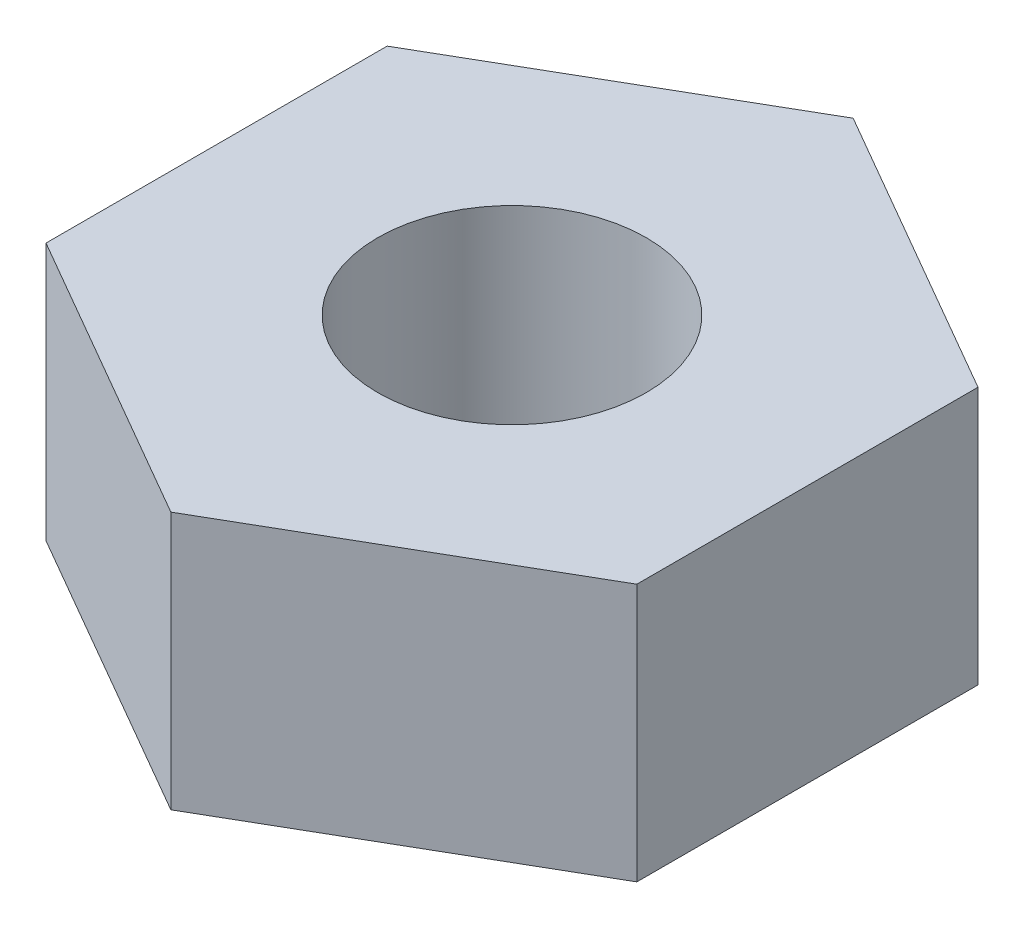
ISO-10303-21;
HEADER;
FILE_DESCRIPTION(('STEP AP214'),'2;1');
FILE_NAME('part.step','',(''),(''),'','','');
FILE_SCHEMA(('AUTOMOTIVE_DESIGN { 1 0 10303 214 1 1 1 1 }'));
ENDSEC;
DATA;
#1=APPLICATION_CONTEXT('core data for automotive mechanical design processes');
#2=APPLICATION_PROTOCOL_DEFINITION('international standard','automotive_design',2000,#1);
#3=PRODUCT_CONTEXT('',#1,'mechanical');
#4=PRODUCT('Part','Part','',(#3));
#5=PRODUCT_RELATED_PRODUCT_CATEGORY('part','',(#4));
#6=PRODUCT_DEFINITION_FORMATION('','',#4);
#7=PRODUCT_DEFINITION_CONTEXT('part definition',#1,'design');
#8=PRODUCT_DEFINITION('design','',#6,#7);
#9=PRODUCT_DEFINITION_SHAPE('','',#8);
#10=(LENGTH_UNIT() NAMED_UNIT(*) SI_UNIT(.MILLI.,.METRE.));
#11=(NAMED_UNIT(*) PLANE_ANGLE_UNIT() SI_UNIT($,.RADIAN.));
#12=(NAMED_UNIT(*) SI_UNIT($,.STERADIAN.) SOLID_ANGLE_UNIT());
#13=UNCERTAINTY_MEASURE_WITH_UNIT(LENGTH_MEASURE(1.E-05),#10,'distance_accuracy_value','');
#14=(GEOMETRIC_REPRESENTATION_CONTEXT(3) GLOBAL_UNCERTAINTY_ASSIGNED_CONTEXT((#13)) GLOBAL_UNIT_ASSIGNED_CONTEXT((#10,
#11,#12)) REPRESENTATION_CONTEXT('',''));
#15=CARTESIAN_POINT('',(0.,0.,0.));
#16=DIRECTION('',(0.,0.,1.));
#17=DIRECTION('',(1.,0.,0.));
#18=AXIS2_PLACEMENT_3D('',#15,#16,#17);
#19=CARTESIAN_POINT('',(0.,2.4,3.17542648054294));
#20=DIRECTION('',(-0.5,0.,-0.866025403784439));
#21=DIRECTION('',(-0.866025403784439,0.,0.5));
#22=AXIS2_PLACEMENT_3D('',#19,#20,#21);
#23=PLANE('',#22);
#24=DIRECTION('',(0.866025403784439,0.,-0.5));
#25=VECTOR('',#24,1.);
#26=CARTESIAN_POINT('',(0.,0.,3.17542648054294));
#27=LINE('',#26,#25);
#28=CARTESIAN_POINT('',(0.,0.,3.17542648054294));
#29=VERTEX_POINT('',#28);
#30=CARTESIAN_POINT('',(2.75,0.,1.58771324027147));
#31=VERTEX_POINT('',#30);
#32=EDGE_CURVE('E120',#29,#31,#27,.T.);
#33=ORIENTED_EDGE('',*,*,#32,.T.);
#34=DIRECTION('',(0.,-1.,0.));
#35=VECTOR('',#34,1.);
#36=CARTESIAN_POINT('',(2.75,2.4,1.58771324027147));
#37=LINE('',#36,#35);
#38=CARTESIAN_POINT('',(2.75,2.4,1.58771324027147));
#39=VERTEX_POINT('',#38);
#40=EDGE_CURVE('E11',#39,#31,#37,.T.);
#41=ORIENTED_EDGE('',*,*,#40,.F.);
#42=DIRECTION('',(0.866025403784439,0.,-0.5));
#43=VECTOR('',#42,1.);
#44=CARTESIAN_POINT('',(0.,2.4,3.17542648054294));
#45=LINE('',#44,#43);
#46=CARTESIAN_POINT('',(0.,2.4,3.17542648054294));
#47=VERTEX_POINT('',#46);
#48=EDGE_CURVE('E131',#47,#39,#45,.T.);
#49=ORIENTED_EDGE('',*,*,#48,.F.);
#50=DIRECTION('',(0.,-1.,0.));
#51=VECTOR('',#50,1.);
#52=CARTESIAN_POINT('',(0.,2.4,3.17542648054294));
#53=LINE('',#52,#51);
#54=EDGE_CURVE('E116',#47,#29,#53,.T.);
#55=ORIENTED_EDGE('',*,*,#54,.T.);
#56=EDGE_LOOP('',(#33,#41,#49,#55));
#57=FACE_BOUND('',#56,.T.);
#58=ADVANCED_FACE('F36',(#57),#23,.F.);
#59=CARTESIAN_POINT('',(2.75,2.4,1.58771324027147));
#60=DIRECTION('',(-1.,0.,0.));
#61=DIRECTION('',(0.,0.,1.));
#62=AXIS2_PLACEMENT_3D('',#59,#60,#61);
#63=PLANE('',#62);
#64=DIRECTION('',(0.,0.,-1.));
#65=VECTOR('',#64,1.);
#66=CARTESIAN_POINT('',(2.75,0.,1.58771324027147));
#67=LINE('',#66,#65);
#68=CARTESIAN_POINT('',(2.75,0.,-1.58771324027147));
#69=VERTEX_POINT('',#68);
#70=EDGE_CURVE('E123',#31,#69,#67,.T.);
#71=ORIENTED_EDGE('',*,*,#70,.T.);
#72=DIRECTION('',(0.,-1.,0.));
#73=VECTOR('',#72,1.);
#74=CARTESIAN_POINT('',(2.75,2.4,-1.58771324027147));
#75=LINE('',#74,#73);
#76=CARTESIAN_POINT('',(2.75,2.4,-1.58771324027147));
#77=VERTEX_POINT('',#76);
#78=EDGE_CURVE('E44',#77,#69,#75,.T.);
#79=ORIENTED_EDGE('',*,*,#78,.F.);
#80=DIRECTION('',(0.,0.,-1.));
#81=VECTOR('',#80,1.);
#82=CARTESIAN_POINT('',(2.75,2.4,1.58771324027147));
#83=LINE('',#82,#81);
#84=EDGE_CURVE('E89',#39,#77,#83,.T.);
#85=ORIENTED_EDGE('',*,*,#84,.F.);
#86=ORIENTED_EDGE('',*,*,#40,.T.);
#87=EDGE_LOOP('',(#71,#79,#85,#86));
#88=FACE_BOUND('',#87,.T.);
#89=ADVANCED_FACE('F156',(#88),#63,.F.);
#90=CARTESIAN_POINT('',(2.75,2.4,-1.58771324027147));
#91=DIRECTION('',(-0.5,0.,0.866025403784439));
#92=DIRECTION('',(0.866025403784439,0.,0.5));
#93=AXIS2_PLACEMENT_3D('',#90,#91,#92);
#94=PLANE('',#93);
#95=DIRECTION('',(-0.866025403784439,0.,-0.5));
#96=VECTOR('',#95,1.);
#97=CARTESIAN_POINT('',(2.75,0.,-1.58771324027147));
#98=LINE('',#97,#96);
#99=CARTESIAN_POINT('',(0.,0.,-3.17542648054294));
#100=VERTEX_POINT('',#99);
#101=EDGE_CURVE('E126',#69,#100,#98,.T.);
#102=ORIENTED_EDGE('',*,*,#101,.T.);
#103=DIRECTION('',(0.,-1.,0.));
#104=VECTOR('',#103,1.);
#105=CARTESIAN_POINT('',(0.,2.4,-3.17542648054294));
#106=LINE('',#105,#104);
#107=CARTESIAN_POINT('',(0.,2.4,-3.17542648054294));
#108=VERTEX_POINT('',#107);
#109=EDGE_CURVE('E111',#108,#100,#106,.T.);
#110=ORIENTED_EDGE('',*,*,#109,.F.);
#111=DIRECTION('',(-0.866025403784439,0.,-0.5));
#112=VECTOR('',#111,1.);
#113=CARTESIAN_POINT('',(2.75,2.4,-1.58771324027147));
#114=LINE('',#113,#112);
#115=EDGE_CURVE('E102',#77,#108,#114,.T.);
#116=ORIENTED_EDGE('',*,*,#115,.F.);
#117=ORIENTED_EDGE('',*,*,#78,.T.);
#118=EDGE_LOOP('',(#102,#110,#116,#117));
#119=FACE_BOUND('',#118,.T.);
#120=ADVANCED_FACE('F137',(#119),#94,.F.);
#121=CARTESIAN_POINT('',(0.,2.4,-3.17542648054294));
#122=DIRECTION('',(0.5,0.,0.866025403784439));
#123=DIRECTION('',(0.866025403784439,0.,-0.5));
#124=AXIS2_PLACEMENT_3D('',#121,#122,#123);
#125=PLANE('',#124);
#126=DIRECTION('',(-0.866025403784439,0.,0.5));
#127=VECTOR('',#126,1.);
#128=CARTESIAN_POINT('',(0.,0.,-3.17542648054294));
#129=LINE('',#128,#127);
#130=CARTESIAN_POINT('',(-2.75,0.,-1.58771324027147));
#131=VERTEX_POINT('',#130);
#132=EDGE_CURVE('E110',#100,#131,#129,.T.);
#133=ORIENTED_EDGE('',*,*,#132,.T.);
#134=DIRECTION('',(0.,-1.,0.));
#135=VECTOR('',#134,1.);
#136=CARTESIAN_POINT('',(-2.75,2.4,-1.58771324027147));
#137=LINE('',#136,#135);
#138=CARTESIAN_POINT('',(-2.75,2.4,-1.58771324027147));
#139=VERTEX_POINT('',#138);
#140=EDGE_CURVE('E107',#139,#131,#137,.T.);
#141=ORIENTED_EDGE('',*,*,#140,.F.);
#142=DIRECTION('',(-0.866025403784439,0.,0.5));
#143=VECTOR('',#142,1.);
#144=CARTESIAN_POINT('',(0.,2.4,-3.17542648054294));
#145=LINE('',#144,#143);
#146=EDGE_CURVE('E96',#108,#139,#145,.T.);
#147=ORIENTED_EDGE('',*,*,#146,.F.);
#148=ORIENTED_EDGE('',*,*,#109,.T.);
#149=EDGE_LOOP('',(#133,#141,#147,#148));
#150=FACE_BOUND('',#149,.T.);
#151=ADVANCED_FACE('F108',(#150),#125,.F.);
#152=CARTESIAN_POINT('',(-2.75,2.4,-1.58771324027147));
#153=DIRECTION('',(1.,0.,0.));
#154=DIRECTION('',(0.,0.,-1.));
#155=AXIS2_PLACEMENT_3D('',#152,#153,#154);
#156=PLANE('',#155);
#157=DIRECTION('',(0.,0.,1.));
#158=VECTOR('',#157,1.);
#159=CARTESIAN_POINT('',(-2.75,0.,-1.58771324027147));
#160=LINE('',#159,#158);
#161=CARTESIAN_POINT('',(-2.75,0.,1.58771324027147));
#162=VERTEX_POINT('',#161);
#163=EDGE_CURVE('E75',#131,#162,#160,.T.);
#164=ORIENTED_EDGE('',*,*,#163,.T.);
#165=DIRECTION('',(0.,-1.,0.));
#166=VECTOR('',#165,1.);
#167=CARTESIAN_POINT('',(-2.75,2.4,1.58771324027147));
#168=LINE('',#167,#166);
#169=CARTESIAN_POINT('',(-2.75,2.4,1.58771324027147));
#170=VERTEX_POINT('',#169);
#171=EDGE_CURVE('E112',#170,#162,#168,.T.);
#172=ORIENTED_EDGE('',*,*,#171,.F.);
#173=DIRECTION('',(0.,0.,1.));
#174=VECTOR('',#173,1.);
#175=CARTESIAN_POINT('',(-2.75,2.4,-1.58771324027147));
#176=LINE('',#175,#174);
#177=EDGE_CURVE('E100',#139,#170,#176,.T.);
#178=ORIENTED_EDGE('',*,*,#177,.F.);
#179=ORIENTED_EDGE('',*,*,#140,.T.);
#180=EDGE_LOOP('',(#164,#172,#178,#179));
#181=FACE_BOUND('',#180,.T.);
#182=ADVANCED_FACE('F114',(#181),#156,.F.);
#183=CARTESIAN_POINT('',(-2.75,2.4,1.58771324027147));
#184=DIRECTION('',(0.5,0.,-0.866025403784439));
#185=DIRECTION('',(-0.866025403784439,0.,-0.5));
#186=AXIS2_PLACEMENT_3D('',#183,#184,#185);
#187=PLANE('',#186);
#188=DIRECTION('',(0.866025403784439,0.,0.5));
#189=VECTOR('',#188,1.);
#190=CARTESIAN_POINT('',(-2.75,0.,1.58771324027147));
#191=LINE('',#190,#189);
#192=EDGE_CURVE('E81',#162,#29,#191,.T.);
#193=ORIENTED_EDGE('',*,*,#192,.T.);
#194=ORIENTED_EDGE('',*,*,#54,.F.);
#195=DIRECTION('',(0.866025403784439,0.,0.5));
#196=VECTOR('',#195,1.);
#197=CARTESIAN_POINT('',(-2.75,2.4,1.58771324027147));
#198=LINE('',#197,#196);
#199=EDGE_CURVE('E52',#170,#47,#198,.T.);
#200=ORIENTED_EDGE('',*,*,#199,.F.);
#201=ORIENTED_EDGE('',*,*,#171,.T.);
#202=EDGE_LOOP('',(#193,#194,#200,#201));
#203=FACE_BOUND('',#202,.T.);
#204=ADVANCED_FACE('F144',(#203),#187,.F.);
#205=CARTESIAN_POINT('',(0.,2.4,0.));
#206=DIRECTION('',(0.,1.,0.));
#207=DIRECTION('',(0.,0.,1.));
#208=AXIS2_PLACEMENT_3D('',#205,#206,#207);
#209=PLANE('',#208);
#210=CARTESIAN_POINT('',(0.,2.4,0.));
#211=DIRECTION('',(0.,-1.,0.));
#212=DIRECTION('',(0.,0.,-1.));
#213=AXIS2_PLACEMENT_3D('',#210,#211,#212);
#214=CIRCLE('',#213,1.25);
#215=CARTESIAN_POINT('',(0.,2.4,-1.25));
#216=VERTEX_POINT('',#215);
#217=EDGE_CURVE('E124',#216,#216,#214,.T.);
#218=ORIENTED_EDGE('',*,*,#217,.T.);
#219=EDGE_LOOP('',(#218));
#220=FACE_BOUND('',#219,.T.);
#221=ORIENTED_EDGE('',*,*,#48,.T.);
#222=ORIENTED_EDGE('',*,*,#84,.T.);
#223=ORIENTED_EDGE('',*,*,#115,.T.);
#224=ORIENTED_EDGE('',*,*,#146,.T.);
#225=ORIENTED_EDGE('',*,*,#177,.T.);
#226=ORIENTED_EDGE('',*,*,#199,.T.);
#227=EDGE_LOOP('',(#221,#222,#223,#224,#225,#226));
#228=FACE_BOUND('',#227,.T.);
#229=ADVANCED_FACE('F98',(#220,#228),#209,.T.);
#230=CARTESIAN_POINT('',(0.,0.,0.));
#231=DIRECTION('',(0.,1.,0.));
#232=DIRECTION('',(0.,0.,1.));
#233=AXIS2_PLACEMENT_3D('',#230,#231,#232);
#234=PLANE('',#233);
#235=CARTESIAN_POINT('',(0.,0.,0.));
#236=DIRECTION('',(0.,-1.,0.));
#237=DIRECTION('',(0.,0.,-1.));
#238=AXIS2_PLACEMENT_3D('',#235,#236,#237);
#239=CIRCLE('',#238,1.24999999999999);
#240=CARTESIAN_POINT('',(0.,0.,-1.24999999999999));
#241=VERTEX_POINT('',#240);
#242=EDGE_CURVE('E213',#241,#241,#239,.T.);
#243=ORIENTED_EDGE('',*,*,#242,.F.);
#244=EDGE_LOOP('',(#243));
#245=FACE_BOUND('',#244,.T.);
#246=ORIENTED_EDGE('',*,*,#32,.F.);
#247=ORIENTED_EDGE('',*,*,#192,.F.);
#248=ORIENTED_EDGE('',*,*,#163,.F.);
#249=ORIENTED_EDGE('',*,*,#132,.F.);
#250=ORIENTED_EDGE('',*,*,#101,.F.);
#251=ORIENTED_EDGE('',*,*,#70,.F.);
#252=EDGE_LOOP('',(#246,#247,#248,#249,#250,#251));
#253=FACE_BOUND('',#252,.T.);
#254=ADVANCED_FACE('F140',(#245,#253),#234,.F.);
#255=CARTESIAN_POINT('',(0.,0.,0.));
#256=DIRECTION('',(0.,-1.,0.));
#257=DIRECTION('',(0.,0.,-1.));
#258=AXIS2_PLACEMENT_3D('',#255,#256,#257);
#259=CYLINDRICAL_SURFACE('',#258,1.24999999999999);
#260=ORIENTED_EDGE('',*,*,#217,.F.);
#261=EDGE_LOOP('',(#260));
#262=FACE_BOUND('',#261,.T.);
#263=ORIENTED_EDGE('',*,*,#242,.T.);
#264=EDGE_LOOP('',(#263));
#265=FACE_BOUND('',#264,.T.);
#266=ADVANCED_FACE('F193',(#262,#265),#259,.F.);
#267=CLOSED_SHELL('',(#58,#89,#120,#151,#182,#204,#229,#254,#266));
#268=MANIFOLD_SOLID_BREP('B2',#267);
#269=ADVANCED_BREP_SHAPE_REPRESENTATION('',(#18,#268),#14);
#270=SHAPE_DEFINITION_REPRESENTATION(#9,#269);
ENDSEC;
END-ISO-10303-21;
